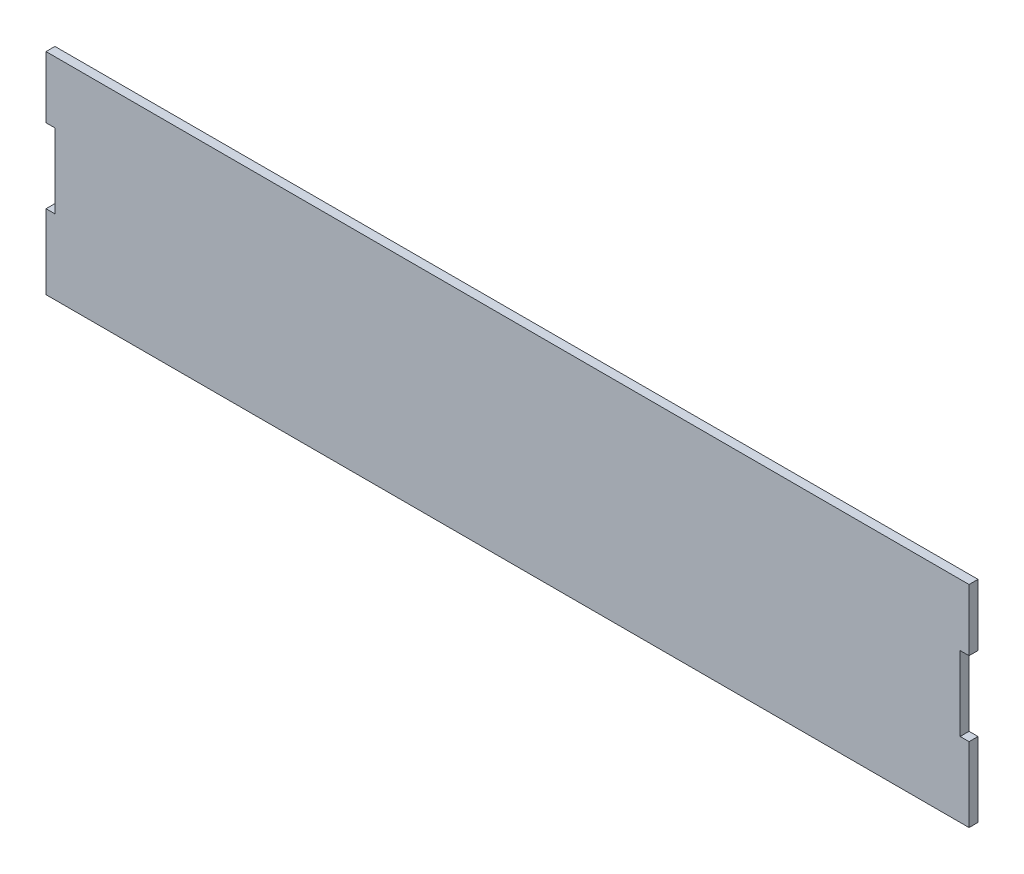
ISO-10303-21;
HEADER;
FILE_DESCRIPTION(('STEP AP214'),'2;1');
FILE_NAME('part.step','',(''),(''),'','','');
FILE_SCHEMA(('AUTOMOTIVE_DESIGN { 1 0 10303 214 1 1 1 1 }'));
ENDSEC;
DATA;
#1=APPLICATION_CONTEXT('core data for automotive mechanical design processes');
#2=APPLICATION_PROTOCOL_DEFINITION('international standard','automotive_design',2000,#1);
#3=PRODUCT_CONTEXT('',#1,'mechanical');
#4=PRODUCT('Part','Part','',(#3));
#5=PRODUCT_RELATED_PRODUCT_CATEGORY('part','',(#4));
#6=PRODUCT_DEFINITION_FORMATION('','',#4);
#7=PRODUCT_DEFINITION_CONTEXT('part definition',#1,'design');
#8=PRODUCT_DEFINITION('design','',#6,#7);
#9=PRODUCT_DEFINITION_SHAPE('','',#8);
#10=(LENGTH_UNIT() NAMED_UNIT(*) SI_UNIT(.MILLI.,.METRE.));
#11=(NAMED_UNIT(*) PLANE_ANGLE_UNIT() SI_UNIT($,.RADIAN.));
#12=(NAMED_UNIT(*) SI_UNIT($,.STERADIAN.) SOLID_ANGLE_UNIT());
#13=UNCERTAINTY_MEASURE_WITH_UNIT(LENGTH_MEASURE(1.E-05),#10,'distance_accuracy_value','');
#14=(GEOMETRIC_REPRESENTATION_CONTEXT(3) GLOBAL_UNCERTAINTY_ASSIGNED_CONTEXT((#13)) GLOBAL_UNIT_ASSIGNED_CONTEXT((#10,
#11,#12)) REPRESENTATION_CONTEXT('',''));
#15=CARTESIAN_POINT('',(0.,0.,0.));
#16=DIRECTION('',(0.,0.,1.));
#17=DIRECTION('',(1.,0.,0.));
#18=AXIS2_PLACEMENT_3D('',#15,#16,#17);
#19=CARTESIAN_POINT('',(-155.,-35.355,3.));
#20=DIRECTION('',(0.,1.,0.));
#21=DIRECTION('',(-1.,0.,0.));
#22=AXIS2_PLACEMENT_3D('',#19,#20,#21);
#23=PLANE('',#22);
#24=DIRECTION('',(1.,0.,0.));
#25=VECTOR('',#24,1.);
#26=CARTESIAN_POINT('',(-155.,-35.355,0.));
#27=LINE('',#26,#25);
#28=CARTESIAN_POINT('',(-155.,-35.355,0.));
#29=VERTEX_POINT('',#28);
#30=CARTESIAN_POINT('',(155.,-35.355,0.));
#31=VERTEX_POINT('',#30);
#32=EDGE_CURVE('E164',#29,#31,#27,.T.);
#33=ORIENTED_EDGE('',*,*,#32,.T.);
#34=DIRECTION('',(0.,0.,-1.));
#35=VECTOR('',#34,1.);
#36=CARTESIAN_POINT('',(155.,-35.355,3.));
#37=LINE('',#36,#35);
#38=CARTESIAN_POINT('',(155.,-35.355,3.));
#39=VERTEX_POINT('',#38);
#40=EDGE_CURVE('E11',#39,#31,#37,.T.);
#41=ORIENTED_EDGE('',*,*,#40,.F.);
#42=DIRECTION('',(1.,0.,0.));
#43=VECTOR('',#42,1.);
#44=CARTESIAN_POINT('',(-155.,-35.355,3.));
#45=LINE('',#44,#43);
#46=CARTESIAN_POINT('',(-155.,-35.355,3.));
#47=VERTEX_POINT('',#46);
#48=EDGE_CURVE('E198',#47,#39,#45,.T.);
#49=ORIENTED_EDGE('',*,*,#48,.F.);
#50=DIRECTION('',(0.,0.,-1.));
#51=VECTOR('',#50,1.);
#52=CARTESIAN_POINT('',(-155.,-35.355,3.));
#53=LINE('',#52,#51);
#54=EDGE_CURVE('E160',#47,#29,#53,.T.);
#55=ORIENTED_EDGE('',*,*,#54,.T.);
#56=EDGE_LOOP('',(#33,#41,#49,#55));
#57=FACE_BOUND('',#56,.T.);
#58=ADVANCED_FACE('F39',(#57),#23,.F.);
#59=CARTESIAN_POINT('',(155.,-10.355,3.));
#60=DIRECTION('',(-1.,0.,0.));
#61=DIRECTION('',(0.,-1.,0.));
#62=AXIS2_PLACEMENT_3D('',#59,#60,#61);
#63=PLANE('',#62);
#64=DIRECTION('',(0.,1.,0.));
#65=VECTOR('',#64,1.);
#66=CARTESIAN_POINT('',(155.,-10.355,0.));
#67=LINE('',#66,#65);
#68=CARTESIAN_POINT('',(155.,-10.355,0.));
#69=VERTEX_POINT('',#68);
#70=EDGE_CURVE('E168',#31,#69,#67,.T.);
#71=ORIENTED_EDGE('',*,*,#70,.T.);
#72=DIRECTION('',(0.,0.,-1.));
#73=VECTOR('',#72,1.);
#74=CARTESIAN_POINT('',(155.,-10.355,3.));
#75=LINE('',#74,#73);
#76=CARTESIAN_POINT('',(155.,-10.355,3.));
#77=VERTEX_POINT('',#76);
#78=EDGE_CURVE('E48',#77,#69,#75,.T.);
#79=ORIENTED_EDGE('',*,*,#78,.F.);
#80=DIRECTION('',(0.,1.,0.));
#81=VECTOR('',#80,1.);
#82=CARTESIAN_POINT('',(155.,-10.355,3.));
#83=LINE('',#82,#81);
#84=EDGE_CURVE('E111',#39,#77,#83,.T.);
#85=ORIENTED_EDGE('',*,*,#84,.F.);
#86=ORIENTED_EDGE('',*,*,#40,.T.);
#87=EDGE_LOOP('',(#71,#79,#85,#86));
#88=FACE_BOUND('',#87,.T.);
#89=ADVANCED_FACE('F292',(#88),#63,.F.);
#90=CARTESIAN_POINT('',(152.,-10.355,3.));
#91=DIRECTION('',(0.,-1.,0.));
#92=DIRECTION('',(1.,0.,0.));
#93=AXIS2_PLACEMENT_3D('',#90,#91,#92);
#94=PLANE('',#93);
#95=DIRECTION('',(-1.,0.,0.));
#96=VECTOR('',#95,1.);
#97=CARTESIAN_POINT('',(152.,-10.355,0.));
#98=LINE('',#97,#96);
#99=CARTESIAN_POINT('',(152.,-10.355,0.));
#100=VERTEX_POINT('',#99);
#101=EDGE_CURVE('E171',#69,#100,#98,.T.);
#102=ORIENTED_EDGE('',*,*,#101,.T.);
#103=DIRECTION('',(0.,0.,-1.));
#104=VECTOR('',#103,1.);
#105=CARTESIAN_POINT('',(152.,-10.355,3.));
#106=LINE('',#105,#104);
#107=CARTESIAN_POINT('',(152.,-10.355,3.));
#108=VERTEX_POINT('',#107);
#109=EDGE_CURVE('E225',#108,#100,#106,.T.);
#110=ORIENTED_EDGE('',*,*,#109,.F.);
#111=DIRECTION('',(-1.,0.,0.));
#112=VECTOR('',#111,1.);
#113=CARTESIAN_POINT('',(152.,-10.355,3.));
#114=LINE('',#113,#112);
#115=EDGE_CURVE('E235',#77,#108,#114,.T.);
#116=ORIENTED_EDGE('',*,*,#115,.F.);
#117=ORIENTED_EDGE('',*,*,#78,.T.);
#118=EDGE_LOOP('',(#102,#110,#116,#117));
#119=FACE_BOUND('',#118,.T.);
#120=ADVANCED_FACE('F233',(#119),#94,.F.);
#121=CARTESIAN_POINT('',(152.,14.645,3.));
#122=DIRECTION('',(-1.,0.,0.));
#123=DIRECTION('',(0.,-1.,0.));
#124=AXIS2_PLACEMENT_3D('',#121,#122,#123);
#125=PLANE('',#124);
#126=DIRECTION('',(0.,1.,0.));
#127=VECTOR('',#126,1.);
#128=CARTESIAN_POINT('',(152.,14.645,0.));
#129=LINE('',#128,#127);
#130=CARTESIAN_POINT('',(152.,14.645,0.));
#131=VERTEX_POINT('',#130);
#132=EDGE_CURVE('E174',#100,#131,#129,.T.);
#133=ORIENTED_EDGE('',*,*,#132,.T.);
#134=DIRECTION('',(0.,0.,-1.));
#135=VECTOR('',#134,1.);
#136=CARTESIAN_POINT('',(152.,14.645,3.));
#137=LINE('',#136,#135);
#138=CARTESIAN_POINT('',(152.,14.645,3.));
#139=VERTEX_POINT('',#138);
#140=EDGE_CURVE('E221',#139,#131,#137,.T.);
#141=ORIENTED_EDGE('',*,*,#140,.F.);
#142=DIRECTION('',(0.,1.,0.));
#143=VECTOR('',#142,1.);
#144=CARTESIAN_POINT('',(152.,14.645,3.));
#145=LINE('',#144,#143);
#146=EDGE_CURVE('E254',#108,#139,#145,.T.);
#147=ORIENTED_EDGE('',*,*,#146,.F.);
#148=ORIENTED_EDGE('',*,*,#109,.T.);
#149=EDGE_LOOP('',(#133,#141,#147,#148));
#150=FACE_BOUND('',#149,.T.);
#151=ADVANCED_FACE('F244',(#150),#125,.F.);
#152=CARTESIAN_POINT('',(155.,14.645,3.));
#153=DIRECTION('',(0.,1.,0.));
#154=DIRECTION('',(-1.,0.,0.));
#155=AXIS2_PLACEMENT_3D('',#152,#153,#154);
#156=PLANE('',#155);
#157=DIRECTION('',(1.,0.,0.));
#158=VECTOR('',#157,1.);
#159=CARTESIAN_POINT('',(155.,14.645,0.));
#160=LINE('',#159,#158);
#161=CARTESIAN_POINT('',(155.,14.645,0.));
#162=VERTEX_POINT('',#161);
#163=EDGE_CURVE('E177',#131,#162,#160,.T.);
#164=ORIENTED_EDGE('',*,*,#163,.T.);
#165=DIRECTION('',(0.,0.,-1.));
#166=VECTOR('',#165,1.);
#167=CARTESIAN_POINT('',(155.,14.645,3.));
#168=LINE('',#167,#166);
#169=CARTESIAN_POINT('',(155.,14.645,3.));
#170=VERTEX_POINT('',#169);
#171=EDGE_CURVE('E217',#170,#162,#168,.T.);
#172=ORIENTED_EDGE('',*,*,#171,.F.);
#173=DIRECTION('',(1.,0.,0.));
#174=VECTOR('',#173,1.);
#175=CARTESIAN_POINT('',(155.,14.645,3.));
#176=LINE('',#175,#174);
#177=EDGE_CURVE('E250',#139,#170,#176,.T.);
#178=ORIENTED_EDGE('',*,*,#177,.F.);
#179=ORIENTED_EDGE('',*,*,#140,.T.);
#180=EDGE_LOOP('',(#164,#172,#178,#179));
#181=FACE_BOUND('',#180,.T.);
#182=ADVANCED_FACE('F248',(#181),#156,.F.);
#183=CARTESIAN_POINT('',(155.,35.355,3.));
#184=DIRECTION('',(-1.,0.,0.));
#185=DIRECTION('',(0.,0.,1.));
#186=AXIS2_PLACEMENT_3D('',#183,#184,#185);
#187=PLANE('',#186);
#188=DIRECTION('',(0.,1.,0.));
#189=VECTOR('',#188,1.);
#190=CARTESIAN_POINT('',(155.,35.355,0.));
#191=LINE('',#190,#189);
#192=CARTESIAN_POINT('',(155.,35.355,0.));
#193=VERTEX_POINT('',#192);
#194=EDGE_CURVE('E180',#162,#193,#191,.T.);
#195=ORIENTED_EDGE('',*,*,#194,.T.);
#196=DIRECTION('',(0.,0.,-1.));
#197=VECTOR('',#196,1.);
#198=CARTESIAN_POINT('',(155.,35.355,3.));
#199=LINE('',#198,#197);
#200=CARTESIAN_POINT('',(155.,35.355,3.));
#201=VERTEX_POINT('',#200);
#202=EDGE_CURVE('E213',#201,#193,#199,.T.);
#203=ORIENTED_EDGE('',*,*,#202,.F.);
#204=DIRECTION('',(0.,1.,0.));
#205=VECTOR('',#204,1.);
#206=CARTESIAN_POINT('',(155.,35.355,3.));
#207=LINE('',#206,#205);
#208=EDGE_CURVE('E253',#170,#201,#207,.T.);
#209=ORIENTED_EDGE('',*,*,#208,.F.);
#210=ORIENTED_EDGE('',*,*,#171,.T.);
#211=EDGE_LOOP('',(#195,#203,#209,#210));
#212=FACE_BOUND('',#211,.T.);
#213=ADVANCED_FACE('F305',(#212),#187,.F.);
#214=CARTESIAN_POINT('',(-155.,35.355,3.));
#215=DIRECTION('',(0.,-1.,0.));
#216=DIRECTION('',(1.,0.,0.));
#217=AXIS2_PLACEMENT_3D('',#214,#215,#216);
#218=PLANE('',#217);
#219=DIRECTION('',(-1.,0.,0.));
#220=VECTOR('',#219,1.);
#221=CARTESIAN_POINT('',(-155.,35.355,0.));
#222=LINE('',#221,#220);
#223=CARTESIAN_POINT('',(-155.,35.355,0.));
#224=VERTEX_POINT('',#223);
#225=EDGE_CURVE('E183',#193,#224,#222,.T.);
#226=ORIENTED_EDGE('',*,*,#225,.T.);
#227=DIRECTION('',(0.,0.,-1.));
#228=VECTOR('',#227,1.);
#229=CARTESIAN_POINT('',(-155.,35.355,3.));
#230=LINE('',#229,#228);
#231=CARTESIAN_POINT('',(-155.,35.355,3.));
#232=VERTEX_POINT('',#231);
#233=EDGE_CURVE('E209',#232,#224,#230,.T.);
#234=ORIENTED_EDGE('',*,*,#233,.F.);
#235=DIRECTION('',(-1.,0.,0.));
#236=VECTOR('',#235,1.);
#237=CARTESIAN_POINT('',(-155.,35.355,3.));
#238=LINE('',#237,#236);
#239=EDGE_CURVE('E258',#201,#232,#238,.T.);
#240=ORIENTED_EDGE('',*,*,#239,.F.);
#241=ORIENTED_EDGE('',*,*,#202,.T.);
#242=EDGE_LOOP('',(#226,#234,#240,#241));
#243=FACE_BOUND('',#242,.T.);
#244=ADVANCED_FACE('F308',(#243),#218,.F.);
#245=CARTESIAN_POINT('',(-155.,35.355,3.));
#246=DIRECTION('',(1.,0.,0.));
#247=DIRECTION('',(0.,0.,-1.));
#248=AXIS2_PLACEMENT_3D('',#245,#246,#247);
#249=PLANE('',#248);
#250=DIRECTION('',(0.,-1.,0.));
#251=VECTOR('',#250,1.);
#252=CARTESIAN_POINT('',(-155.,35.355,0.));
#253=LINE('',#252,#251);
#254=CARTESIAN_POINT('',(-155.,14.645,0.));
#255=VERTEX_POINT('',#254);
#256=EDGE_CURVE('E186',#224,#255,#253,.T.);
#257=ORIENTED_EDGE('',*,*,#256,.T.);
#258=DIRECTION('',(0.,0.,-1.));
#259=VECTOR('',#258,1.);
#260=CARTESIAN_POINT('',(-155.,14.645,3.));
#261=LINE('',#260,#259);
#262=CARTESIAN_POINT('',(-155.,14.645,3.));
#263=VERTEX_POINT('',#262);
#264=EDGE_CURVE('E205',#263,#255,#261,.T.);
#265=ORIENTED_EDGE('',*,*,#264,.F.);
#266=DIRECTION('',(0.,-1.,0.));
#267=VECTOR('',#266,1.);
#268=CARTESIAN_POINT('',(-155.,35.355,3.));
#269=LINE('',#268,#267);
#270=EDGE_CURVE('E265',#232,#263,#269,.T.);
#271=ORIENTED_EDGE('',*,*,#270,.F.);
#272=ORIENTED_EDGE('',*,*,#233,.T.);
#273=EDGE_LOOP('',(#257,#265,#271,#272));
#274=FACE_BOUND('',#273,.T.);
#275=ADVANCED_FACE('F273',(#274),#249,.F.);
#276=CARTESIAN_POINT('',(-155.,14.645,3.));
#277=DIRECTION('',(0.,1.,0.));
#278=DIRECTION('',(0.,0.,1.));
#279=AXIS2_PLACEMENT_3D('',#276,#277,#278);
#280=PLANE('',#279);
#281=DIRECTION('',(1.,0.,0.));
#282=VECTOR('',#281,1.);
#283=CARTESIAN_POINT('',(-155.,14.645,0.));
#284=LINE('',#283,#282);
#285=CARTESIAN_POINT('',(-152.,14.645,0.));
#286=VERTEX_POINT('',#285);
#287=EDGE_CURVE('E189',#255,#286,#284,.T.);
#288=ORIENTED_EDGE('',*,*,#287,.T.);
#289=DIRECTION('',(0.,0.,-1.));
#290=VECTOR('',#289,1.);
#291=CARTESIAN_POINT('',(-152.,14.645,3.));
#292=LINE('',#291,#290);
#293=CARTESIAN_POINT('',(-152.,14.645,3.));
#294=VERTEX_POINT('',#293);
#295=EDGE_CURVE('E153',#294,#286,#292,.T.);
#296=ORIENTED_EDGE('',*,*,#295,.F.);
#297=DIRECTION('',(1.,0.,0.));
#298=VECTOR('',#297,1.);
#299=CARTESIAN_POINT('',(-155.,14.645,3.));
#300=LINE('',#299,#298);
#301=EDGE_CURVE('E142',#263,#294,#300,.T.);
#302=ORIENTED_EDGE('',*,*,#301,.F.);
#303=ORIENTED_EDGE('',*,*,#264,.T.);
#304=EDGE_LOOP('',(#288,#296,#302,#303));
#305=FACE_BOUND('',#304,.T.);
#306=ADVANCED_FACE('F277',(#305),#280,.F.);
#307=CARTESIAN_POINT('',(-152.,14.645,3.));
#308=DIRECTION('',(1.,0.,0.));
#309=DIRECTION('',(0.,1.,0.));
#310=AXIS2_PLACEMENT_3D('',#307,#308,#309);
#311=PLANE('',#310);
#312=DIRECTION('',(0.,-1.,0.));
#313=VECTOR('',#312,1.);
#314=CARTESIAN_POINT('',(-152.,14.645,0.));
#315=LINE('',#314,#313);
#316=CARTESIAN_POINT('',(-152.,-10.355,0.));
#317=VERTEX_POINT('',#316);
#318=EDGE_CURVE('E151',#286,#317,#315,.T.);
#319=ORIENTED_EDGE('',*,*,#318,.T.);
#320=DIRECTION('',(0.,0.,-1.));
#321=VECTOR('',#320,1.);
#322=CARTESIAN_POINT('',(-152.,-10.355,3.));
#323=LINE('',#322,#321);
#324=CARTESIAN_POINT('',(-152.,-10.355,3.));
#325=VERTEX_POINT('',#324);
#326=EDGE_CURVE('E148',#325,#317,#323,.T.);
#327=ORIENTED_EDGE('',*,*,#326,.F.);
#328=DIRECTION('',(0.,-1.,0.));
#329=VECTOR('',#328,1.);
#330=CARTESIAN_POINT('',(-152.,14.645,3.));
#331=LINE('',#330,#329);
#332=EDGE_CURVE('E136',#294,#325,#331,.T.);
#333=ORIENTED_EDGE('',*,*,#332,.F.);
#334=ORIENTED_EDGE('',*,*,#295,.T.);
#335=EDGE_LOOP('',(#319,#327,#333,#334));
#336=FACE_BOUND('',#335,.T.);
#337=ADVANCED_FACE('F149',(#336),#311,.F.);
#338=CARTESIAN_POINT('',(-152.,-10.355,3.));
#339=DIRECTION('',(0.,-1.,0.));
#340=DIRECTION('',(0.,0.,-1.));
#341=AXIS2_PLACEMENT_3D('',#338,#339,#340);
#342=PLANE('',#341);
#343=DIRECTION('',(-1.,0.,0.));
#344=VECTOR('',#343,1.);
#345=CARTESIAN_POINT('',(-152.,-10.355,0.));
#346=LINE('',#345,#344);
#347=CARTESIAN_POINT('',(-155.,-10.355,0.));
#348=VERTEX_POINT('',#347);
#349=EDGE_CURVE('E97',#317,#348,#346,.T.);
#350=ORIENTED_EDGE('',*,*,#349,.T.);
#351=DIRECTION('',(0.,0.,-1.));
#352=VECTOR('',#351,1.);
#353=CARTESIAN_POINT('',(-155.,-10.355,3.));
#354=LINE('',#353,#352);
#355=CARTESIAN_POINT('',(-155.,-10.355,3.));
#356=VERTEX_POINT('',#355);
#357=EDGE_CURVE('E154',#356,#348,#354,.T.);
#358=ORIENTED_EDGE('',*,*,#357,.F.);
#359=DIRECTION('',(-1.,0.,0.));
#360=VECTOR('',#359,1.);
#361=CARTESIAN_POINT('',(-152.,-10.355,3.));
#362=LINE('',#361,#360);
#363=EDGE_CURVE('E140',#325,#356,#362,.T.);
#364=ORIENTED_EDGE('',*,*,#363,.F.);
#365=ORIENTED_EDGE('',*,*,#326,.T.);
#366=EDGE_LOOP('',(#350,#358,#364,#365));
#367=FACE_BOUND('',#366,.T.);
#368=ADVANCED_FACE('F156',(#367),#342,.F.);
#369=CARTESIAN_POINT('',(-155.,-10.355,3.));
#370=DIRECTION('',(1.,0.,0.));
#371=DIRECTION('',(0.,1.,0.));
#372=AXIS2_PLACEMENT_3D('',#369,#370,#371);
#373=PLANE('',#372);
#374=DIRECTION('',(0.,-1.,0.));
#375=VECTOR('',#374,1.);
#376=CARTESIAN_POINT('',(-155.,-10.355,0.));
#377=LINE('',#376,#375);
#378=EDGE_CURVE('E103',#348,#29,#377,.T.);
#379=ORIENTED_EDGE('',*,*,#378,.T.);
#380=ORIENTED_EDGE('',*,*,#54,.F.);
#381=DIRECTION('',(0.,-1.,0.));
#382=VECTOR('',#381,1.);
#383=CARTESIAN_POINT('',(-155.,-10.355,3.));
#384=LINE('',#383,#382);
#385=EDGE_CURVE('E56',#356,#47,#384,.T.);
#386=ORIENTED_EDGE('',*,*,#385,.F.);
#387=ORIENTED_EDGE('',*,*,#357,.T.);
#388=EDGE_LOOP('',(#379,#380,#386,#387));
#389=FACE_BOUND('',#388,.T.);
#390=ADVANCED_FACE('F281',(#389),#373,.F.);
#391=CARTESIAN_POINT('',(0.,0.,3.));
#392=DIRECTION('',(0.,0.,-1.));
#393=DIRECTION('',(-1.,0.,0.));
#394=AXIS2_PLACEMENT_3D('',#391,#392,#393);
#395=PLANE('',#394);
#396=ORIENTED_EDGE('',*,*,#48,.T.);
#397=ORIENTED_EDGE('',*,*,#84,.T.);
#398=ORIENTED_EDGE('',*,*,#115,.T.);
#399=ORIENTED_EDGE('',*,*,#146,.T.);
#400=ORIENTED_EDGE('',*,*,#177,.T.);
#401=ORIENTED_EDGE('',*,*,#208,.T.);
#402=ORIENTED_EDGE('',*,*,#239,.T.);
#403=ORIENTED_EDGE('',*,*,#270,.T.);
#404=ORIENTED_EDGE('',*,*,#301,.T.);
#405=ORIENTED_EDGE('',*,*,#332,.T.);
#406=ORIENTED_EDGE('',*,*,#363,.T.);
#407=ORIENTED_EDGE('',*,*,#385,.T.);
#408=EDGE_LOOP('',(#396,#397,#398,#399,#400,#401,#402,#403,#404,#405,#406,#407));
#409=FACE_BOUND('',#408,.T.);
#410=ADVANCED_FACE('F138',(#409),#395,.F.);
#411=CARTESIAN_POINT('',(0.,0.,0.));
#412=DIRECTION('',(0.,0.,-1.));
#413=DIRECTION('',(-1.,0.,0.));
#414=AXIS2_PLACEMENT_3D('',#411,#412,#413);
#415=PLANE('',#414);
#416=ORIENTED_EDGE('',*,*,#32,.F.);
#417=ORIENTED_EDGE('',*,*,#378,.F.);
#418=ORIENTED_EDGE('',*,*,#349,.F.);
#419=ORIENTED_EDGE('',*,*,#318,.F.);
#420=ORIENTED_EDGE('',*,*,#287,.F.);
#421=ORIENTED_EDGE('',*,*,#256,.F.);
#422=ORIENTED_EDGE('',*,*,#225,.F.);
#423=ORIENTED_EDGE('',*,*,#194,.F.);
#424=ORIENTED_EDGE('',*,*,#163,.F.);
#425=ORIENTED_EDGE('',*,*,#132,.F.);
#426=ORIENTED_EDGE('',*,*,#101,.F.);
#427=ORIENTED_EDGE('',*,*,#70,.F.);
#428=EDGE_LOOP('',(#416,#417,#418,#419,#420,#421,#422,#423,#424,#425,#426,#427));
#429=FACE_BOUND('',#428,.T.);
#430=ADVANCED_FACE('F239',(#429),#415,.T.);
#431=CLOSED_SHELL('',(#58,#89,#120,#151,#182,#213,#244,#275,#306,#337,#368,#390,#410,#430));
#432=MANIFOLD_SOLID_BREP('B2',#431);
#433=ADVANCED_BREP_SHAPE_REPRESENTATION('',(#18,#432),#14);
#434=SHAPE_DEFINITION_REPRESENTATION(#9,#433);
ENDSEC;
END-ISO-10303-21;
